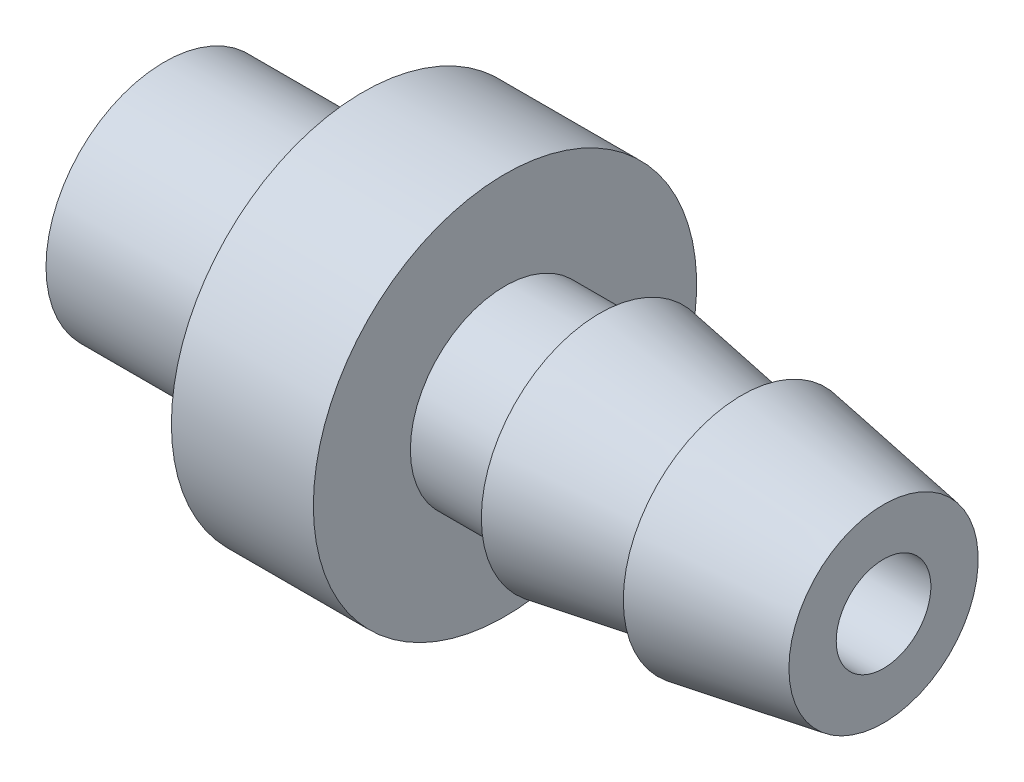
ISO-10303-21;
HEADER;
FILE_DESCRIPTION(('STEP AP214'),'2;1');
FILE_NAME('part.step','',(''),(''),'','','');
FILE_SCHEMA(('AUTOMOTIVE_DESIGN { 1 0 10303 214 1 1 1 1 }'));
ENDSEC;
DATA;
#1=APPLICATION_CONTEXT('core data for automotive mechanical design processes');
#2=APPLICATION_PROTOCOL_DEFINITION('international standard','automotive_design',2000,#1);
#3=PRODUCT_CONTEXT('',#1,'mechanical');
#4=PRODUCT('Part','Part','',(#3));
#5=PRODUCT_RELATED_PRODUCT_CATEGORY('part','',(#4));
#6=PRODUCT_DEFINITION_FORMATION('','',#4);
#7=PRODUCT_DEFINITION_CONTEXT('part definition',#1,'design');
#8=PRODUCT_DEFINITION('design','',#6,#7);
#9=PRODUCT_DEFINITION_SHAPE('','',#8);
#10=(LENGTH_UNIT() NAMED_UNIT(*) SI_UNIT(.MILLI.,.METRE.));
#11=(NAMED_UNIT(*) PLANE_ANGLE_UNIT() SI_UNIT($,.RADIAN.));
#12=(NAMED_UNIT(*) SI_UNIT($,.STERADIAN.) SOLID_ANGLE_UNIT());
#13=UNCERTAINTY_MEASURE_WITH_UNIT(LENGTH_MEASURE(1.E-05),#10,'distance_accuracy_value','');
#14=(GEOMETRIC_REPRESENTATION_CONTEXT(3) GLOBAL_UNCERTAINTY_ASSIGNED_CONTEXT((#13)) GLOBAL_UNIT_ASSIGNED_CONTEXT((#10,
#11,#12)) REPRESENTATION_CONTEXT('',''));
#15=CARTESIAN_POINT('',(0.,0.,0.));
#16=DIRECTION('',(0.,0.,1.));
#17=DIRECTION('',(1.,0.,0.));
#18=AXIS2_PLACEMENT_3D('',#15,#16,#17);
#19=CARTESIAN_POINT('',(0.,0.,0.));
#20=DIRECTION('',(-1.,0.,0.));
#21=DIRECTION('',(0.,0.,1.));
#22=AXIS2_PLACEMENT_3D('',#19,#20,#21);
#23=CYLINDRICAL_SURFACE('',#22,2.5);
#24=CARTESIAN_POINT('',(-4.2,0.,0.));
#25=DIRECTION('',(-1.,0.,0.));
#26=DIRECTION('',(0.,0.,1.));
#27=AXIS2_PLACEMENT_3D('',#24,#25,#26);
#28=CIRCLE('',#27,2.5);
#29=CARTESIAN_POINT('',(-4.2,0.,2.5));
#30=VERTEX_POINT('',#29);
#31=EDGE_CURVE('E70',#30,#30,#28,.T.);
#32=ORIENTED_EDGE('',*,*,#31,.F.);
#33=EDGE_LOOP('',(#32));
#34=FACE_BOUND('',#33,.T.);
#35=CARTESIAN_POINT('',(0.,0.,0.));
#36=DIRECTION('',(-1.,0.,0.));
#37=DIRECTION('',(0.,0.,1.));
#38=AXIS2_PLACEMENT_3D('',#35,#36,#37);
#39=CIRCLE('',#38,2.5);
#40=CARTESIAN_POINT('',(0.,0.,2.5));
#41=VERTEX_POINT('',#40);
#42=EDGE_CURVE('E10',#41,#41,#39,.T.);
#43=ORIENTED_EDGE('',*,*,#42,.T.);
#44=EDGE_LOOP('',(#43));
#45=FACE_BOUND('',#44,.T.);
#46=ADVANCED_FACE('F30',(#34,#45),#23,.T.);
#47=CARTESIAN_POINT('',(0.,4.05,0.));
#48=DIRECTION('',(1.,0.,0.));
#49=DIRECTION('',(0.,0.,-1.));
#50=AXIS2_PLACEMENT_3D('',#47,#48,#49);
#51=PLANE('',#50);
#52=ORIENTED_EDGE('',*,*,#42,.F.);
#53=EDGE_LOOP('',(#52));
#54=FACE_BOUND('',#53,.T.);
#55=CARTESIAN_POINT('',(0.,0.,0.));
#56=DIRECTION('',(-1.,0.,0.));
#57=DIRECTION('',(0.,0.,1.));
#58=AXIS2_PLACEMENT_3D('',#55,#56,#57);
#59=CIRCLE('',#58,4.05);
#60=CARTESIAN_POINT('',(0.,0.,4.05));
#61=VERTEX_POINT('',#60);
#62=EDGE_CURVE('E36',#61,#61,#59,.T.);
#63=ORIENTED_EDGE('',*,*,#62,.T.);
#64=EDGE_LOOP('',(#63));
#65=FACE_BOUND('',#64,.T.);
#66=ADVANCED_FACE('F77',(#54,#65),#51,.F.);
#67=CARTESIAN_POINT('',(0.,0.,0.));
#68=DIRECTION('',(-1.,0.,0.));
#69=DIRECTION('',(0.,0.,1.));
#70=AXIS2_PLACEMENT_3D('',#67,#68,#69);
#71=CYLINDRICAL_SURFACE('',#70,4.05);
#72=ORIENTED_EDGE('',*,*,#62,.F.);
#73=EDGE_LOOP('',(#72));
#74=FACE_BOUND('',#73,.T.);
#75=CARTESIAN_POINT('',(3.,0.,0.));
#76=DIRECTION('',(-1.,0.,0.));
#77=DIRECTION('',(0.,0.,1.));
#78=AXIS2_PLACEMENT_3D('',#75,#76,#77);
#79=CIRCLE('',#78,4.05);
#80=CARTESIAN_POINT('',(3.,0.,4.05));
#81=VERTEX_POINT('',#80);
#82=EDGE_CURVE('E40',#81,#81,#79,.T.);
#83=ORIENTED_EDGE('',*,*,#82,.T.);
#84=EDGE_LOOP('',(#83));
#85=FACE_BOUND('',#84,.T.);
#86=ADVANCED_FACE('F81',(#74,#85),#71,.T.);
#87=CARTESIAN_POINT('',(3.,2.,0.));
#88=DIRECTION('',(-1.,0.,0.));
#89=DIRECTION('',(0.,0.,1.));
#90=AXIS2_PLACEMENT_3D('',#87,#88,#89);
#91=PLANE('',#90);
#92=ORIENTED_EDGE('',*,*,#82,.F.);
#93=EDGE_LOOP('',(#92));
#94=FACE_BOUND('',#93,.T.);
#95=CARTESIAN_POINT('',(3.,0.,0.));
#96=DIRECTION('',(-1.,0.,0.));
#97=DIRECTION('',(0.,0.,1.));
#98=AXIS2_PLACEMENT_3D('',#95,#96,#97);
#99=CIRCLE('',#98,2.);
#100=CARTESIAN_POINT('',(3.,0.,2.));
#101=VERTEX_POINT('',#100);
#102=EDGE_CURVE('E44',#101,#101,#99,.T.);
#103=ORIENTED_EDGE('',*,*,#102,.T.);
#104=EDGE_LOOP('',(#103));
#105=FACE_BOUND('',#104,.T.);
#106=ADVANCED_FACE('F86',(#94,#105),#91,.F.);
#107=CARTESIAN_POINT('',(0.,0.,0.));
#108=DIRECTION('',(-1.,0.,0.));
#109=DIRECTION('',(0.,0.,1.));
#110=AXIS2_PLACEMENT_3D('',#107,#108,#109);
#111=CYLINDRICAL_SURFACE('',#110,2.);
#112=ORIENTED_EDGE('',*,*,#102,.F.);
#113=EDGE_LOOP('',(#112));
#114=FACE_BOUND('',#113,.T.);
#115=CARTESIAN_POINT('',(5.,0.,0.));
#116=DIRECTION('',(-1.,0.,0.));
#117=DIRECTION('',(0.,0.,1.));
#118=AXIS2_PLACEMENT_3D('',#115,#116,#117);
#119=CIRCLE('',#118,2.);
#120=CARTESIAN_POINT('',(5.,0.,2.));
#121=VERTEX_POINT('',#120);
#122=EDGE_CURVE('E49',#121,#121,#119,.T.);
#123=ORIENTED_EDGE('',*,*,#122,.T.);
#124=EDGE_LOOP('',(#123));
#125=FACE_BOUND('',#124,.T.);
#126=ADVANCED_FACE('F92',(#114,#125),#111,.T.);
#127=CARTESIAN_POINT('',(5.,2.5,0.));
#128=DIRECTION('',(1.,0.,0.));
#129=DIRECTION('',(0.,0.,-1.));
#130=AXIS2_PLACEMENT_3D('',#127,#128,#129);
#131=PLANE('',#130);
#132=ORIENTED_EDGE('',*,*,#122,.F.);
#133=EDGE_LOOP('',(#132));
#134=FACE_BOUND('',#133,.T.);
#135=CARTESIAN_POINT('',(5.,0.,0.));
#136=DIRECTION('',(-1.,0.,0.));
#137=DIRECTION('',(0.,0.,1.));
#138=AXIS2_PLACEMENT_3D('',#135,#136,#137);
#139=CIRCLE('',#138,2.5);
#140=CARTESIAN_POINT('',(5.,0.,2.5));
#141=VERTEX_POINT('',#140);
#142=EDGE_CURVE('E52',#141,#141,#139,.T.);
#143=ORIENTED_EDGE('',*,*,#142,.T.);
#144=EDGE_LOOP('',(#143));
#145=FACE_BOUND('',#144,.T.);
#146=ADVANCED_FACE('F96',(#134,#145),#131,.F.);
#147=CARTESIAN_POINT('',(8.,0.,0.));
#148=DIRECTION('',(-1.,0.,0.));
#149=DIRECTION('',(0.,0.,1.));
#150=AXIS2_PLACEMENT_3D('',#147,#148,#149);
#151=CONICAL_SURFACE('',#150,2.,0.165148677414627);
#152=ORIENTED_EDGE('',*,*,#142,.F.);
#153=EDGE_LOOP('',(#152));
#154=FACE_BOUND('',#153,.T.);
#155=CARTESIAN_POINT('',(8.,0.,0.));
#156=DIRECTION('',(-1.,0.,0.));
#157=DIRECTION('',(0.,0.,1.));
#158=AXIS2_PLACEMENT_3D('',#155,#156,#157);
#159=CIRCLE('',#158,2.);
#160=CARTESIAN_POINT('',(8.,0.,2.));
#161=VERTEX_POINT('',#160);
#162=EDGE_CURVE('E55',#161,#161,#159,.T.);
#163=ORIENTED_EDGE('',*,*,#162,.T.);
#164=EDGE_LOOP('',(#163));
#165=FACE_BOUND('',#164,.T.);
#166=ADVANCED_FACE('F100',(#154,#165),#151,.T.);
#167=CARTESIAN_POINT('',(8.,2.5,0.));
#168=DIRECTION('',(1.,0.,0.));
#169=DIRECTION('',(0.,0.,-1.));
#170=AXIS2_PLACEMENT_3D('',#167,#168,#169);
#171=PLANE('',#170);
#172=ORIENTED_EDGE('',*,*,#162,.F.);
#173=EDGE_LOOP('',(#172));
#174=FACE_BOUND('',#173,.T.);
#175=CARTESIAN_POINT('',(8.,0.,0.));
#176=DIRECTION('',(-1.,0.,0.));
#177=DIRECTION('',(0.,0.,1.));
#178=AXIS2_PLACEMENT_3D('',#175,#176,#177);
#179=CIRCLE('',#178,2.5);
#180=CARTESIAN_POINT('',(8.,0.,2.5));
#181=VERTEX_POINT('',#180);
#182=EDGE_CURVE('E58',#181,#181,#179,.T.);
#183=ORIENTED_EDGE('',*,*,#182,.T.);
#184=EDGE_LOOP('',(#183));
#185=FACE_BOUND('',#184,.T.);
#186=ADVANCED_FACE('F104',(#174,#185),#171,.F.);
#187=CARTESIAN_POINT('',(11.,0.,0.));
#188=DIRECTION('',(-1.,0.,0.));
#189=DIRECTION('',(0.,0.,1.));
#190=AXIS2_PLACEMENT_3D('',#187,#188,#189);
#191=CONICAL_SURFACE('',#190,2.,0.165148677414627);
#192=ORIENTED_EDGE('',*,*,#182,.F.);
#193=EDGE_LOOP('',(#192));
#194=FACE_BOUND('',#193,.T.);
#195=CARTESIAN_POINT('',(11.,0.,0.));
#196=DIRECTION('',(-1.,0.,0.));
#197=DIRECTION('',(0.,0.,1.));
#198=AXIS2_PLACEMENT_3D('',#195,#196,#197);
#199=CIRCLE('',#198,2.);
#200=CARTESIAN_POINT('',(11.,0.,2.));
#201=VERTEX_POINT('',#200);
#202=EDGE_CURVE('E61',#201,#201,#199,.T.);
#203=ORIENTED_EDGE('',*,*,#202,.T.);
#204=EDGE_LOOP('',(#203));
#205=FACE_BOUND('',#204,.T.);
#206=ADVANCED_FACE('F108',(#194,#205),#191,.T.);
#207=CARTESIAN_POINT('',(11.,1.,0.));
#208=DIRECTION('',(-1.,0.,0.));
#209=DIRECTION('',(0.,0.,1.));
#210=AXIS2_PLACEMENT_3D('',#207,#208,#209);
#211=PLANE('',#210);
#212=ORIENTED_EDGE('',*,*,#202,.F.);
#213=EDGE_LOOP('',(#212));
#214=FACE_BOUND('',#213,.T.);
#215=CARTESIAN_POINT('',(11.,0.,0.));
#216=DIRECTION('',(-1.,0.,0.));
#217=DIRECTION('',(0.,0.,1.));
#218=AXIS2_PLACEMENT_3D('',#215,#216,#217);
#219=CIRCLE('',#218,1.);
#220=CARTESIAN_POINT('',(11.,0.,1.));
#221=VERTEX_POINT('',#220);
#222=EDGE_CURVE('E64',#221,#221,#219,.T.);
#223=ORIENTED_EDGE('',*,*,#222,.T.);
#224=EDGE_LOOP('',(#223));
#225=FACE_BOUND('',#224,.T.);
#226=ADVANCED_FACE('F112',(#214,#225),#211,.F.);
#227=CARTESIAN_POINT('',(0.,0.,0.));
#228=DIRECTION('',(-1.,0.,0.));
#229=DIRECTION('',(0.,0.,1.));
#230=AXIS2_PLACEMENT_3D('',#227,#228,#229);
#231=CYLINDRICAL_SURFACE('',#230,1.);
#232=ORIENTED_EDGE('',*,*,#222,.F.);
#233=EDGE_LOOP('',(#232));
#234=FACE_BOUND('',#233,.T.);
#235=CARTESIAN_POINT('',(-4.2,0.,0.));
#236=DIRECTION('',(-1.,0.,0.));
#237=DIRECTION('',(0.,0.,1.));
#238=AXIS2_PLACEMENT_3D('',#235,#236,#237);
#239=CIRCLE('',#238,1.);
#240=CARTESIAN_POINT('',(-4.2,0.,1.));
#241=VERTEX_POINT('',#240);
#242=EDGE_CURVE('E67',#241,#241,#239,.T.);
#243=ORIENTED_EDGE('',*,*,#242,.T.);
#244=EDGE_LOOP('',(#243));
#245=FACE_BOUND('',#244,.T.);
#246=ADVANCED_FACE('F116',(#234,#245),#231,.F.);
#247=CARTESIAN_POINT('',(-4.2,1.,0.));
#248=DIRECTION('',(1.,0.,0.));
#249=DIRECTION('',(0.,0.,-1.));
#250=AXIS2_PLACEMENT_3D('',#247,#248,#249);
#251=PLANE('',#250);
#252=ORIENTED_EDGE('',*,*,#242,.F.);
#253=EDGE_LOOP('',(#252));
#254=FACE_BOUND('',#253,.T.);
#255=ORIENTED_EDGE('',*,*,#31,.T.);
#256=EDGE_LOOP('',(#255));
#257=FACE_BOUND('',#256,.T.);
#258=ADVANCED_FACE('F74',(#254,#257),#251,.F.);
#259=CLOSED_SHELL('',(#46,#66,#86,#106,#126,#146,#166,#186,#206,#226,#246,#258));
#260=MANIFOLD_SOLID_BREP('B2',#259);
#261=ADVANCED_BREP_SHAPE_REPRESENTATION('',(#18,#260),#14);
#262=SHAPE_DEFINITION_REPRESENTATION(#9,#261);
ENDSEC;
END-ISO-10303-21;
